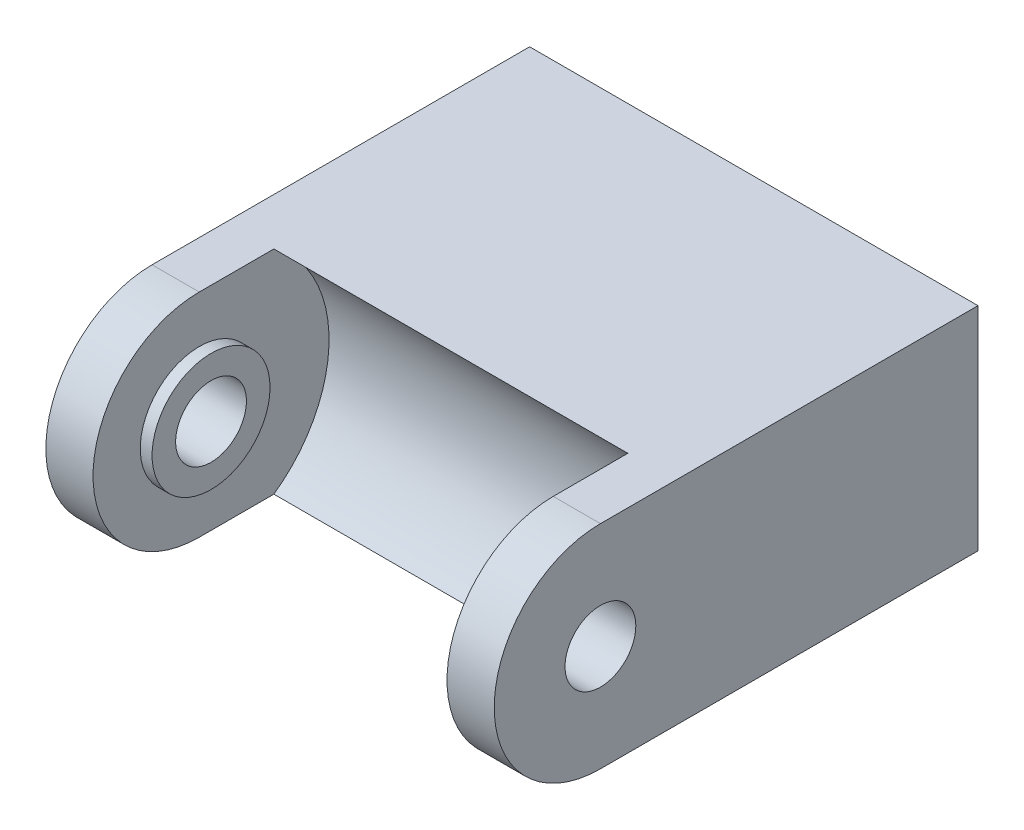
ISO-10303-21;
HEADER;
FILE_DESCRIPTION(('STEP AP214'),'2;1');
FILE_NAME('part.step','',(''),(''),'','','');
FILE_SCHEMA(('AUTOMOTIVE_DESIGN { 1 0 10303 214 1 1 1 1 }'));
ENDSEC;
DATA;
#1=APPLICATION_CONTEXT('core data for automotive mechanical design processes');
#2=APPLICATION_PROTOCOL_DEFINITION('international standard','automotive_design',2000,#1);
#3=PRODUCT_CONTEXT('',#1,'mechanical');
#4=PRODUCT('Part','Part','',(#3));
#5=PRODUCT_RELATED_PRODUCT_CATEGORY('part','',(#4));
#6=PRODUCT_DEFINITION_FORMATION('','',#4);
#7=PRODUCT_DEFINITION_CONTEXT('part definition',#1,'design');
#8=PRODUCT_DEFINITION('design','',#6,#7);
#9=PRODUCT_DEFINITION_SHAPE('','',#8);
#10=(LENGTH_UNIT() NAMED_UNIT(*) SI_UNIT(.MILLI.,.METRE.));
#11=(NAMED_UNIT(*) PLANE_ANGLE_UNIT() SI_UNIT($,.RADIAN.));
#12=(NAMED_UNIT(*) SI_UNIT($,.STERADIAN.) SOLID_ANGLE_UNIT());
#13=UNCERTAINTY_MEASURE_WITH_UNIT(LENGTH_MEASURE(1.E-05),#10,'distance_accuracy_value','');
#14=(GEOMETRIC_REPRESENTATION_CONTEXT(3) GLOBAL_UNCERTAINTY_ASSIGNED_CONTEXT((#13)) GLOBAL_UNIT_ASSIGNED_CONTEXT((#10,
#11,#12)) REPRESENTATION_CONTEXT('',''));
#15=CARTESIAN_POINT('',(0.,0.,0.));
#16=DIRECTION('',(0.,0.,1.));
#17=DIRECTION('',(1.,0.,0.));
#18=AXIS2_PLACEMENT_3D('',#15,#16,#17);
#19=CARTESIAN_POINT('',(-9.5,0.,0.));
#20=DIRECTION('',(1.,0.,0.));
#21=DIRECTION('',(0.,0.,-1.));
#22=AXIS2_PLACEMENT_3D('',#19,#20,#21);
#23=CYLINDRICAL_SURFACE('',#22,4.5);
#24=DIRECTION('',(1.,0.,0.));
#25=VECTOR('',#24,1.);
#26=CARTESIAN_POINT('',(-9.5,-4.5,0.));
#27=LINE('',#26,#25);
#28=CARTESIAN_POINT('',(-9.5,-4.5,0.));
#29=VERTEX_POINT('',#28);
#30=CARTESIAN_POINT('',(-7.5,-4.5,0.));
#31=VERTEX_POINT('',#30);
#32=EDGE_CURVE('E170',#29,#31,#27,.T.);
#33=ORIENTED_EDGE('',*,*,#32,.T.);
#34=CARTESIAN_POINT('',(-7.5,0.,0.));
#35=DIRECTION('',(1.,0.,0.));
#36=DIRECTION('',(0.,0.,-1.));
#37=AXIS2_PLACEMENT_3D('',#34,#35,#36);
#38=CIRCLE('',#37,4.5);
#39=CARTESIAN_POINT('',(-7.5,4.5,0.));
#40=VERTEX_POINT('',#39);
#41=EDGE_CURVE('E115',#31,#40,#38,.F.);
#42=ORIENTED_EDGE('',*,*,#41,.T.);
#43=DIRECTION('',(1.,0.,0.));
#44=VECTOR('',#43,1.);
#45=CARTESIAN_POINT('',(-9.5,4.5,0.));
#46=LINE('',#45,#44);
#47=CARTESIAN_POINT('',(-9.5,4.5,0.));
#48=VERTEX_POINT('',#47);
#49=EDGE_CURVE('E174',#48,#40,#46,.T.);
#50=ORIENTED_EDGE('',*,*,#49,.F.);
#51=CARTESIAN_POINT('',(-9.5,0.,0.));
#52=DIRECTION('',(1.,0.,0.));
#53=DIRECTION('',(0.,0.,-1.));
#54=AXIS2_PLACEMENT_3D('',#51,#52,#53);
#55=CIRCLE('',#54,4.5);
#56=EDGE_CURVE('E159',#48,#29,#55,.T.);
#57=ORIENTED_EDGE('',*,*,#56,.T.);
#58=EDGE_LOOP('',(#33,#42,#50,#57));
#59=FACE_BOUND('',#58,.T.);
#60=ADVANCED_FACE('F34',(#59),#23,.T.);
#61=CARTESIAN_POINT('',(-9.5,4.5,0.));
#62=DIRECTION('',(0.,-1.,0.));
#63=DIRECTION('',(0.,0.,-1.));
#64=AXIS2_PLACEMENT_3D('',#61,#62,#63);
#65=PLANE('',#64);
#66=DIRECTION('',(-1.,0.,0.));
#67=VECTOR('',#66,1.);
#68=CARTESIAN_POINT('',(7.,4.5,-3.16227766016838));
#69=LINE('',#68,#67);
#70=CARTESIAN_POINT('',(7.5,4.5,-3.16227766016838));
#71=VERTEX_POINT('',#70);
#72=CARTESIAN_POINT('',(-7.5,4.5,-3.16227766016838));
#73=VERTEX_POINT('',#72);
#74=EDGE_CURVE('E96',#71,#73,#69,.T.);
#75=ORIENTED_EDGE('',*,*,#74,.F.);
#76=DIRECTION('',(0.,0.,1.));
#77=VECTOR('',#76,1.);
#78=CARTESIAN_POINT('',(7.5,4.5,0.));
#79=LINE('',#78,#77);
#80=CARTESIAN_POINT('',(7.5,4.5,0.));
#81=VERTEX_POINT('',#80);
#82=EDGE_CURVE('E98',#71,#81,#79,.T.);
#83=ORIENTED_EDGE('',*,*,#82,.T.);
#84=CARTESIAN_POINT('',(9.5,4.5,0.));
#85=VERTEX_POINT('',#84);
#86=EDGE_CURVE('E165',#81,#85,#46,.T.);
#87=ORIENTED_EDGE('',*,*,#86,.T.);
#88=DIRECTION('',(0.,0.,-1.));
#89=VECTOR('',#88,1.);
#90=CARTESIAN_POINT('',(9.5,4.5,0.));
#91=LINE('',#90,#89);
#92=CARTESIAN_POINT('',(9.5,4.5,-16.));
#93=VERTEX_POINT('',#92);
#94=EDGE_CURVE('E106',#85,#93,#91,.T.);
#95=ORIENTED_EDGE('',*,*,#94,.T.);
#96=DIRECTION('',(1.,0.,0.));
#97=VECTOR('',#96,1.);
#98=CARTESIAN_POINT('',(-9.5,4.5,-16.));
#99=LINE('',#98,#97);
#100=CARTESIAN_POINT('',(-9.5,4.5,-16.));
#101=VERTEX_POINT('',#100);
#102=EDGE_CURVE('E166',#101,#93,#99,.T.);
#103=ORIENTED_EDGE('',*,*,#102,.F.);
#104=DIRECTION('',(0.,0.,-1.));
#105=VECTOR('',#104,1.);
#106=CARTESIAN_POINT('',(-9.5,4.5,0.));
#107=LINE('',#106,#105);
#108=EDGE_CURVE('E157',#48,#101,#107,.T.);
#109=ORIENTED_EDGE('',*,*,#108,.F.);
#110=ORIENTED_EDGE('',*,*,#49,.T.);
#111=DIRECTION('',(0.,0.,1.));
#112=VECTOR('',#111,1.);
#113=CARTESIAN_POINT('',(-7.5,4.5,0.));
#114=LINE('',#113,#112);
#115=EDGE_CURVE('E101',#73,#40,#114,.T.);
#116=ORIENTED_EDGE('',*,*,#115,.F.);
#117=EDGE_LOOP('',(#75,#83,#87,#95,#103,#109,#110,#116));
#118=FACE_BOUND('',#117,.T.);
#119=ADVANCED_FACE('F36',(#118),#65,.F.);
#120=CARTESIAN_POINT('',(-9.5,-4.5,0.));
#121=DIRECTION('',(0.,1.,0.));
#122=DIRECTION('',(0.,0.,1.));
#123=AXIS2_PLACEMENT_3D('',#120,#121,#122);
#124=PLANE('',#123);
#125=CARTESIAN_POINT('',(7.5,-4.5,0.));
#126=VERTEX_POINT('',#125);
#127=CARTESIAN_POINT('',(9.5,-4.5,0.));
#128=VERTEX_POINT('',#127);
#129=EDGE_CURVE('E173',#126,#128,#27,.T.);
#130=ORIENTED_EDGE('',*,*,#129,.F.);
#131=DIRECTION('',(0.,0.,-1.));
#132=VECTOR('',#131,1.);
#133=CARTESIAN_POINT('',(7.5,-4.5,0.));
#134=LINE('',#133,#132);
#135=CARTESIAN_POINT('',(7.5,-4.5,-3.16227766016838));
#136=VERTEX_POINT('',#135);
#137=EDGE_CURVE('E116',#126,#136,#134,.T.);
#138=ORIENTED_EDGE('',*,*,#137,.T.);
#139=DIRECTION('',(-1.,0.,0.));
#140=VECTOR('',#139,1.);
#141=CARTESIAN_POINT('',(7.,-4.5,-3.16227766016838));
#142=LINE('',#141,#140);
#143=CARTESIAN_POINT('',(-7.5,-4.5,-3.16227766016838));
#144=VERTEX_POINT('',#143);
#145=EDGE_CURVE('E119',#144,#136,#142,.F.);
#146=ORIENTED_EDGE('',*,*,#145,.F.);
#147=DIRECTION('',(0.,0.,-1.));
#148=VECTOR('',#147,1.);
#149=CARTESIAN_POINT('',(-7.5,-4.5,0.));
#150=LINE('',#149,#148);
#151=EDGE_CURVE('E11',#31,#144,#150,.T.);
#152=ORIENTED_EDGE('',*,*,#151,.F.);
#153=ORIENTED_EDGE('',*,*,#32,.F.);
#154=DIRECTION('',(0.,0.,1.));
#155=VECTOR('',#154,1.);
#156=CARTESIAN_POINT('',(-9.5,-4.5,0.));
#157=LINE('',#156,#155);
#158=CARTESIAN_POINT('',(-9.5,-4.5,-16.));
#159=VERTEX_POINT('',#158);
#160=EDGE_CURVE('E162',#159,#29,#157,.T.);
#161=ORIENTED_EDGE('',*,*,#160,.F.);
#162=DIRECTION('',(1.,0.,0.));
#163=VECTOR('',#162,1.);
#164=CARTESIAN_POINT('',(-9.5,-4.5,-16.));
#165=LINE('',#164,#163);
#166=CARTESIAN_POINT('',(9.5,-4.5,-16.));
#167=VERTEX_POINT('',#166);
#168=EDGE_CURVE('E168',#159,#167,#165,.T.);
#169=ORIENTED_EDGE('',*,*,#168,.T.);
#170=DIRECTION('',(0.,0.,1.));
#171=VECTOR('',#170,1.);
#172=CARTESIAN_POINT('',(9.5,-4.5,0.));
#173=LINE('',#172,#171);
#174=EDGE_CURVE('E151',#167,#128,#173,.T.);
#175=ORIENTED_EDGE('',*,*,#174,.T.);
#176=EDGE_LOOP('',(#130,#138,#146,#152,#153,#161,#169,#175));
#177=FACE_BOUND('',#176,.T.);
#178=ADVANCED_FACE('F226',(#177),#124,.F.);
#179=CARTESIAN_POINT('',(7.,0.,0.));
#180=DIRECTION('',(1.,0.,0.));
#181=DIRECTION('',(0.,0.,-1.));
#182=AXIS2_PLACEMENT_3D('',#179,#180,#181);
#183=PLANE('',#182);
#184=CARTESIAN_POINT('',(7.,0.,0.));
#185=DIRECTION('',(1.,0.,0.));
#186=DIRECTION('',(0.,0.,-1.));
#187=AXIS2_PLACEMENT_3D('',#184,#185,#186);
#188=CIRCLE('',#187,1.5);
#189=CARTESIAN_POINT('',(7.,0.,-1.5));
#190=VERTEX_POINT('',#189);
#191=EDGE_CURVE('E107',#190,#190,#188,.T.);
#192=ORIENTED_EDGE('',*,*,#191,.T.);
#193=EDGE_LOOP('',(#192));
#194=FACE_BOUND('',#193,.T.);
#195=CARTESIAN_POINT('',(7.,0.,0.));
#196=DIRECTION('',(1.,0.,0.));
#197=DIRECTION('',(0.,0.,-1.));
#198=AXIS2_PLACEMENT_3D('',#195,#196,#197);
#199=CIRCLE('',#198,2.5);
#200=CARTESIAN_POINT('',(7.,0.,-2.5));
#201=VERTEX_POINT('',#200);
#202=EDGE_CURVE('E124',#201,#201,#199,.F.);
#203=ORIENTED_EDGE('',*,*,#202,.T.);
#204=EDGE_LOOP('',(#203));
#205=FACE_BOUND('',#204,.T.);
#206=ADVANCED_FACE('F187',(#194,#205),#183,.F.);
#207=CARTESIAN_POINT('',(-7.,0.,0.));
#208=DIRECTION('',(1.,0.,0.));
#209=DIRECTION('',(0.,0.,-1.));
#210=AXIS2_PLACEMENT_3D('',#207,#208,#209);
#211=PLANE('',#210);
#212=CARTESIAN_POINT('',(-7.,0.,0.));
#213=DIRECTION('',(1.,0.,0.));
#214=DIRECTION('',(0.,0.,-1.));
#215=AXIS2_PLACEMENT_3D('',#212,#213,#214);
#216=CIRCLE('',#215,1.5);
#217=CARTESIAN_POINT('',(-7.,0.,-1.5));
#218=VERTEX_POINT('',#217);
#219=EDGE_CURVE('E143',#218,#218,#216,.T.);
#220=ORIENTED_EDGE('',*,*,#219,.F.);
#221=EDGE_LOOP('',(#220));
#222=FACE_BOUND('',#221,.T.);
#223=CARTESIAN_POINT('',(-7.,0.,0.));
#224=DIRECTION('',(1.,0.,0.));
#225=DIRECTION('',(0.,0.,-1.));
#226=AXIS2_PLACEMENT_3D('',#223,#224,#225);
#227=CIRCLE('',#226,2.5);
#228=CARTESIAN_POINT('',(-7.,0.,-2.5));
#229=VERTEX_POINT('',#228);
#230=EDGE_CURVE('E120',#229,#229,#227,.F.);
#231=ORIENTED_EDGE('',*,*,#230,.F.);
#232=EDGE_LOOP('',(#231));
#233=FACE_BOUND('',#232,.T.);
#234=ADVANCED_FACE('F183',(#222,#233),#211,.T.);
#235=CARTESIAN_POINT('',(-9.5,0.,-16.));
#236=DIRECTION('',(0.,0.,1.));
#237=DIRECTION('',(1.,0.,0.));
#238=AXIS2_PLACEMENT_3D('',#235,#236,#237);
#239=PLANE('',#238);
#240=CARTESIAN_POINT('',(0.,0.,-16.));
#241=DIRECTION('',(0.,0.,-1.));
#242=DIRECTION('',(-1.,0.,0.));
#243=AXIS2_PLACEMENT_3D('',#240,#241,#242);
#244=CIRCLE('',#243,1.75);
#245=CARTESIAN_POINT('',(-1.75,0.,-16.));
#246=VERTEX_POINT('',#245);
#247=EDGE_CURVE('E205',#246,#246,#244,.T.);
#248=ORIENTED_EDGE('',*,*,#247,.F.);
#249=EDGE_LOOP('',(#248));
#250=FACE_BOUND('',#249,.T.);
#251=ORIENTED_EDGE('',*,*,#102,.T.);
#252=DIRECTION('',(0.,-1.,0.));
#253=VECTOR('',#252,1.);
#254=CARTESIAN_POINT('',(9.5,0.,-16.));
#255=LINE('',#254,#253);
#256=EDGE_CURVE('E154',#93,#167,#255,.T.);
#257=ORIENTED_EDGE('',*,*,#256,.T.);
#258=ORIENTED_EDGE('',*,*,#168,.F.);
#259=DIRECTION('',(0.,-1.,0.));
#260=VECTOR('',#259,1.);
#261=CARTESIAN_POINT('',(-9.5,0.,-16.));
#262=LINE('',#261,#260);
#263=EDGE_CURVE('E49',#101,#159,#262,.T.);
#264=ORIENTED_EDGE('',*,*,#263,.F.);
#265=EDGE_LOOP('',(#251,#257,#258,#264));
#266=FACE_BOUND('',#265,.T.);
#267=ADVANCED_FACE('F186',(#250,#266),#239,.F.);
#268=CARTESIAN_POINT('',(7.5,0.,0.));
#269=DIRECTION('',(1.,0.,0.));
#270=DIRECTION('',(0.,0.,-1.));
#271=AXIS2_PLACEMENT_3D('',#268,#269,#270);
#272=CIRCLE('',#271,4.5);
#273=EDGE_CURVE('E42',#126,#81,#272,.F.);
#274=ORIENTED_EDGE('',*,*,#273,.F.);
#275=ORIENTED_EDGE('',*,*,#129,.T.);
#276=CARTESIAN_POINT('',(9.5,0.,0.));
#277=DIRECTION('',(1.,0.,0.));
#278=DIRECTION('',(0.,0.,-1.));
#279=AXIS2_PLACEMENT_3D('',#276,#277,#278);
#280=CIRCLE('',#279,4.5);
#281=EDGE_CURVE('E148',#85,#128,#280,.T.);
#282=ORIENTED_EDGE('',*,*,#281,.F.);
#283=ORIENTED_EDGE('',*,*,#86,.F.);
#284=EDGE_LOOP('',(#274,#275,#282,#283));
#285=FACE_BOUND('',#284,.T.);
#286=ADVANCED_FACE('F214',(#285),#23,.T.);
#287=CARTESIAN_POINT('',(-9.5,0.,0.));
#288=DIRECTION('',(1.,0.,0.));
#289=DIRECTION('',(0.,0.,-1.));
#290=AXIS2_PLACEMENT_3D('',#287,#288,#289);
#291=PLANE('',#290);
#292=CARTESIAN_POINT('',(-9.5,0.,0.));
#293=DIRECTION('',(1.,0.,0.));
#294=DIRECTION('',(0.,0.,-1.));
#295=AXIS2_PLACEMENT_3D('',#292,#293,#294);
#296=CIRCLE('',#295,1.5);
#297=CARTESIAN_POINT('',(-9.5,0.,-1.5));
#298=VERTEX_POINT('',#297);
#299=EDGE_CURVE('E140',#298,#298,#296,.T.);
#300=ORIENTED_EDGE('',*,*,#299,.T.);
#301=EDGE_LOOP('',(#300));
#302=FACE_BOUND('',#301,.T.);
#303=ORIENTED_EDGE('',*,*,#108,.T.);
#304=ORIENTED_EDGE('',*,*,#263,.T.);
#305=ORIENTED_EDGE('',*,*,#160,.T.);
#306=ORIENTED_EDGE('',*,*,#56,.F.);
#307=EDGE_LOOP('',(#303,#304,#305,#306));
#308=FACE_BOUND('',#307,.T.);
#309=ADVANCED_FACE('F231',(#302,#308),#291,.F.);
#310=CARTESIAN_POINT('',(9.5,0.,0.));
#311=DIRECTION('',(1.,0.,0.));
#312=DIRECTION('',(0.,0.,-1.));
#313=AXIS2_PLACEMENT_3D('',#310,#311,#312);
#314=PLANE('',#313);
#315=CARTESIAN_POINT('',(9.5,0.,0.));
#316=DIRECTION('',(1.,0.,0.));
#317=DIRECTION('',(0.,0.,-1.));
#318=AXIS2_PLACEMENT_3D('',#315,#316,#317);
#319=CIRCLE('',#318,1.5);
#320=CARTESIAN_POINT('',(9.5,0.,-1.5));
#321=VERTEX_POINT('',#320);
#322=EDGE_CURVE('E137',#321,#321,#319,.T.);
#323=ORIENTED_EDGE('',*,*,#322,.F.);
#324=EDGE_LOOP('',(#323));
#325=FACE_BOUND('',#324,.T.);
#326=ORIENTED_EDGE('',*,*,#94,.F.);
#327=ORIENTED_EDGE('',*,*,#281,.T.);
#328=ORIENTED_EDGE('',*,*,#174,.F.);
#329=ORIENTED_EDGE('',*,*,#256,.F.);
#330=EDGE_LOOP('',(#326,#327,#328,#329));
#331=FACE_BOUND('',#330,.T.);
#332=ADVANCED_FACE('F223',(#325,#331),#314,.T.);
#333=CARTESIAN_POINT('',(7.,0.,0.));
#334=DIRECTION('',(-1.,0.,0.));
#335=DIRECTION('',(0.,0.,1.));
#336=AXIS2_PLACEMENT_3D('',#333,#334,#335);
#337=CYLINDRICAL_SURFACE('',#336,5.5);
#338=ORIENTED_EDGE('',*,*,#74,.T.);
#339=CARTESIAN_POINT('',(-7.5,0.,0.));
#340=DIRECTION('',(1.,0.,0.));
#341=DIRECTION('',(0.,0.,-1.));
#342=AXIS2_PLACEMENT_3D('',#339,#340,#341);
#343=CIRCLE('',#342,5.5);
#344=EDGE_CURVE('E127',#144,#73,#343,.T.);
#345=ORIENTED_EDGE('',*,*,#344,.F.);
#346=ORIENTED_EDGE('',*,*,#145,.T.);
#347=CARTESIAN_POINT('',(7.5,0.,0.));
#348=DIRECTION('',(1.,0.,0.));
#349=DIRECTION('',(0.,0.,-1.));
#350=AXIS2_PLACEMENT_3D('',#347,#348,#349);
#351=CIRCLE('',#350,5.5);
#352=EDGE_CURVE('E112',#136,#71,#351,.T.);
#353=ORIENTED_EDGE('',*,*,#352,.T.);
#354=EDGE_LOOP('',(#338,#345,#346,#353));
#355=FACE_BOUND('',#354,.T.);
#356=ADVANCED_FACE('F118',(#355),#337,.F.);
#357=CARTESIAN_POINT('',(-9.5,0.,0.));
#358=DIRECTION('',(1.,0.,0.));
#359=DIRECTION('',(0.,0.,-1.));
#360=AXIS2_PLACEMENT_3D('',#357,#358,#359);
#361=CYLINDRICAL_SURFACE('',#360,1.5);
#362=ORIENTED_EDGE('',*,*,#219,.T.);
#363=EDGE_LOOP('',(#362));
#364=FACE_BOUND('',#363,.T.);
#365=ORIENTED_EDGE('',*,*,#299,.F.);
#366=EDGE_LOOP('',(#365));
#367=FACE_BOUND('',#366,.T.);
#368=ADVANCED_FACE('F180',(#364,#367),#361,.F.);
#369=ORIENTED_EDGE('',*,*,#322,.T.);
#370=EDGE_LOOP('',(#369));
#371=FACE_BOUND('',#370,.T.);
#372=ORIENTED_EDGE('',*,*,#191,.F.);
#373=EDGE_LOOP('',(#372));
#374=FACE_BOUND('',#373,.T.);
#375=ADVANCED_FACE('F195',(#371,#374),#361,.F.);
#376=CARTESIAN_POINT('',(7.5,0.,0.));
#377=DIRECTION('',(-1.,0.,0.));
#378=DIRECTION('',(0.,0.,1.));
#379=AXIS2_PLACEMENT_3D('',#376,#377,#378);
#380=CYLINDRICAL_SURFACE('',#379,2.5);
#381=ORIENTED_EDGE('',*,*,#230,.T.);
#382=EDGE_LOOP('',(#381));
#383=FACE_BOUND('',#382,.T.);
#384=CARTESIAN_POINT('',(-7.5,0.,0.));
#385=DIRECTION('',(1.,0.,0.));
#386=DIRECTION('',(0.,0.,-1.));
#387=AXIS2_PLACEMENT_3D('',#384,#385,#386);
#388=CIRCLE('',#387,2.5);
#389=CARTESIAN_POINT('',(-7.5,0.,-2.5));
#390=VERTEX_POINT('',#389);
#391=EDGE_CURVE('E200',#390,#390,#388,.T.);
#392=ORIENTED_EDGE('',*,*,#391,.T.);
#393=EDGE_LOOP('',(#392));
#394=FACE_BOUND('',#393,.T.);
#395=ADVANCED_FACE('F191',(#383,#394),#380,.T.);
#396=CARTESIAN_POINT('',(-7.5,0.,0.));
#397=DIRECTION('',(1.,0.,0.));
#398=DIRECTION('',(0.,0.,-1.));
#399=AXIS2_PLACEMENT_3D('',#396,#397,#398);
#400=PLANE('',#399);
#401=ORIENTED_EDGE('',*,*,#391,.F.);
#402=EDGE_LOOP('',(#401));
#403=FACE_BOUND('',#402,.T.);
#404=ORIENTED_EDGE('',*,*,#115,.T.);
#405=ORIENTED_EDGE('',*,*,#41,.F.);
#406=ORIENTED_EDGE('',*,*,#151,.T.);
#407=ORIENTED_EDGE('',*,*,#344,.T.);
#408=EDGE_LOOP('',(#404,#405,#406,#407));
#409=FACE_BOUND('',#408,.T.);
#410=ADVANCED_FACE('F194',(#403,#409),#400,.T.);
#411=CARTESIAN_POINT('',(7.5,0.,0.));
#412=DIRECTION('',(1.,0.,0.));
#413=DIRECTION('',(0.,0.,-1.));
#414=AXIS2_PLACEMENT_3D('',#411,#412,#413);
#415=PLANE('',#414);
#416=CARTESIAN_POINT('',(7.5,0.,0.));
#417=DIRECTION('',(1.,0.,0.));
#418=DIRECTION('',(0.,0.,-1.));
#419=AXIS2_PLACEMENT_3D('',#416,#417,#418);
#420=CIRCLE('',#419,2.5);
#421=CARTESIAN_POINT('',(7.5,0.,-2.5));
#422=VERTEX_POINT('',#421);
#423=EDGE_CURVE('E121',#422,#422,#420,.T.);
#424=ORIENTED_EDGE('',*,*,#423,.T.);
#425=EDGE_LOOP('',(#424));
#426=FACE_BOUND('',#425,.T.);
#427=ORIENTED_EDGE('',*,*,#352,.F.);
#428=ORIENTED_EDGE('',*,*,#137,.F.);
#429=ORIENTED_EDGE('',*,*,#273,.T.);
#430=ORIENTED_EDGE('',*,*,#82,.F.);
#431=EDGE_LOOP('',(#427,#428,#429,#430));
#432=FACE_BOUND('',#431,.T.);
#433=ADVANCED_FACE('F111',(#426,#432),#415,.F.);
#434=ORIENTED_EDGE('',*,*,#423,.F.);
#435=EDGE_LOOP('',(#434));
#436=FACE_BOUND('',#435,.T.);
#437=ORIENTED_EDGE('',*,*,#202,.F.);
#438=EDGE_LOOP('',(#437));
#439=FACE_BOUND('',#438,.T.);
#440=ADVANCED_FACE('F197',(#436,#439),#380,.T.);
#441=CARTESIAN_POINT('',(0.,0.,-14.));
#442=DIRECTION('',(0.,0.,-1.));
#443=DIRECTION('',(-1.,0.,0.));
#444=AXIS2_PLACEMENT_3D('',#441,#442,#443);
#445=CYLINDRICAL_SURFACE('',#444,1.75);
#446=CARTESIAN_POINT('',(0.,0.,-14.));
#447=DIRECTION('',(0.,0.,-1.));
#448=DIRECTION('',(-1.,0.,0.));
#449=AXIS2_PLACEMENT_3D('',#446,#447,#448);
#450=CIRCLE('',#449,1.75);
#451=CARTESIAN_POINT('',(-1.75,0.,-14.));
#452=VERTEX_POINT('',#451);
#453=EDGE_CURVE('E202',#452,#452,#450,.T.);
#454=ORIENTED_EDGE('',*,*,#453,.F.);
#455=EDGE_LOOP('',(#454));
#456=FACE_BOUND('',#455,.T.);
#457=ORIENTED_EDGE('',*,*,#247,.T.);
#458=EDGE_LOOP('',(#457));
#459=FACE_BOUND('',#458,.T.);
#460=ADVANCED_FACE('F211',(#456,#459),#445,.F.);
#461=CARTESIAN_POINT('',(0.,0.,-14.));
#462=DIRECTION('',(0.,0.,-1.));
#463=DIRECTION('',(-1.,0.,0.));
#464=AXIS2_PLACEMENT_3D('',#461,#462,#463);
#465=PLANE('',#464);
#466=ORIENTED_EDGE('',*,*,#453,.T.);
#467=EDGE_LOOP('',(#466));
#468=FACE_BOUND('',#467,.T.);
#469=ADVANCED_FACE('F269',(#468),#465,.T.);
#470=CLOSED_SHELL('',(#60,#119,#178,#206,#234,#267,#286,#309,#332,#356,#368,#375,#395,#410,#433,
#440,#460,#469));
#471=MANIFOLD_SOLID_BREP('B2',#470);
#472=ADVANCED_BREP_SHAPE_REPRESENTATION('',(#18,#471),#14);
#473=SHAPE_DEFINITION_REPRESENTATION(#9,#472);
ENDSEC;
END-ISO-10303-21;
